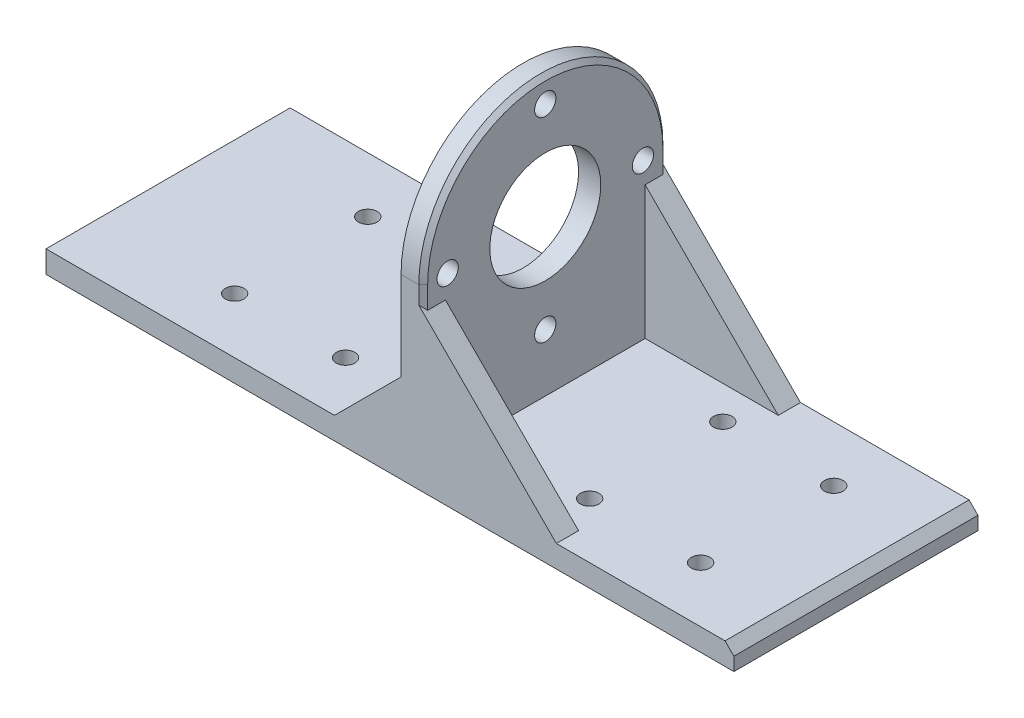
ISO-10303-21;
HEADER;
FILE_DESCRIPTION(('STEP AP214'),'2;1');
FILE_NAME('part.step','',(''),(''),'','','');
FILE_SCHEMA(('AUTOMOTIVE_DESIGN { 1 0 10303 214 1 1 1 1 }'));
ENDSEC;
DATA;
#1=APPLICATION_CONTEXT('core data for automotive mechanical design processes');
#2=APPLICATION_PROTOCOL_DEFINITION('international standard','automotive_design',2000,#1);
#3=PRODUCT_CONTEXT('',#1,'mechanical');
#4=PRODUCT('Part','Part','',(#3));
#5=PRODUCT_RELATED_PRODUCT_CATEGORY('part','',(#4));
#6=PRODUCT_DEFINITION_FORMATION('','',#4);
#7=PRODUCT_DEFINITION_CONTEXT('part definition',#1,'design');
#8=PRODUCT_DEFINITION('design','',#6,#7);
#9=PRODUCT_DEFINITION_SHAPE('','',#8);
#10=(LENGTH_UNIT() NAMED_UNIT(*) SI_UNIT(.MILLI.,.METRE.));
#11=(NAMED_UNIT(*) PLANE_ANGLE_UNIT() SI_UNIT($,.RADIAN.));
#12=(NAMED_UNIT(*) SI_UNIT($,.STERADIAN.) SOLID_ANGLE_UNIT());
#13=UNCERTAINTY_MEASURE_WITH_UNIT(LENGTH_MEASURE(1.E-05),#10,'distance_accuracy_value','');
#14=(GEOMETRIC_REPRESENTATION_CONTEXT(3) GLOBAL_UNCERTAINTY_ASSIGNED_CONTEXT((#13)) GLOBAL_UNIT_ASSIGNED_CONTEXT((#10,
#11,#12)) REPRESENTATION_CONTEXT('',''));
#15=CARTESIAN_POINT('',(0.,0.,0.));
#16=DIRECTION('',(0.,0.,1.));
#17=DIRECTION('',(1.,0.,0.));
#18=AXIS2_PLACEMENT_3D('',#15,#16,#17);
#19=CARTESIAN_POINT('',(5.,0.,0.));
#20=DIRECTION('',(1.,0.,0.));
#21=DIRECTION('',(0.,0.,-1.));
#22=AXIS2_PLACEMENT_3D('',#19,#20,#21);
#23=PLANE('',#22);
#24=DIRECTION('',(0.,0.,-1.));
#25=VECTOR('',#24,1.);
#26=CARTESIAN_POINT('',(5.,-5.00000000000001,0.));
#27=LINE('',#26,#25);
#28=CARTESIAN_POINT('',(5.,-5.00000000000001,-26.5));
#29=VERTEX_POINT('',#28);
#30=CARTESIAN_POINT('',(5.,-5.00000000000001,-22.5));
#31=VERTEX_POINT('',#30);
#32=EDGE_CURVE('E202',#29,#31,#27,.F.);
#33=ORIENTED_EDGE('',*,*,#32,.F.);
#34=DIRECTION('',(0.,1.,0.));
#35=VECTOR('',#34,1.);
#36=CARTESIAN_POINT('',(5.,0.,-26.5));
#37=LINE('',#36,#35);
#38=CARTESIAN_POINT('',(5.,0.,-26.5));
#39=VERTEX_POINT('',#38);
#40=EDGE_CURVE('E408',#29,#39,#37,.T.);
#41=ORIENTED_EDGE('',*,*,#40,.T.);
#42=CARTESIAN_POINT('',(5.,0.,0.));
#43=DIRECTION('',(1.,0.,0.));
#44=DIRECTION('',(0.,0.,-1.));
#45=AXIS2_PLACEMENT_3D('',#42,#43,#44);
#46=CIRCLE('',#45,26.5);
#47=CARTESIAN_POINT('',(5.,0.,26.5));
#48=VERTEX_POINT('',#47);
#49=EDGE_CURVE('E188',#39,#48,#46,.T.);
#50=ORIENTED_EDGE('',*,*,#49,.T.);
#51=DIRECTION('',(0.,-1.,0.));
#52=VECTOR('',#51,1.);
#53=CARTESIAN_POINT('',(5.,-5.00000000000002,26.5));
#54=LINE('',#53,#52);
#55=CARTESIAN_POINT('',(5.,-5.00000000000001,26.5));
#56=VERTEX_POINT('',#55);
#57=EDGE_CURVE('E405',#48,#56,#54,.T.);
#58=ORIENTED_EDGE('',*,*,#57,.T.);
#59=DIRECTION('',(0.,0.,1.));
#60=VECTOR('',#59,1.);
#61=CARTESIAN_POINT('',(5.,-5.00000000000001,0.));
#62=LINE('',#61,#60);
#63=CARTESIAN_POINT('',(5.,-5.00000000000001,22.5));
#64=VERTEX_POINT('',#63);
#65=EDGE_CURVE('E229',#64,#56,#62,.T.);
#66=ORIENTED_EDGE('',*,*,#65,.F.);
#67=DIRECTION('',(0.,-1.,0.));
#68=VECTOR('',#67,1.);
#69=CARTESIAN_POINT('',(5.,0.,22.5));
#70=LINE('',#69,#68);
#71=CARTESIAN_POINT('',(5.,-35.,22.5));
#72=VERTEX_POINT('',#71);
#73=EDGE_CURVE('E222',#64,#72,#70,.T.);
#74=ORIENTED_EDGE('',*,*,#73,.T.);
#75=DIRECTION('',(0.,0.,1.));
#76=VECTOR('',#75,1.);
#77=CARTESIAN_POINT('',(5.,-35.,27.5));
#78=LINE('',#77,#76);
#79=CARTESIAN_POINT('',(5.,-35.,-22.5));
#80=VERTEX_POINT('',#79);
#81=EDGE_CURVE('E233',#80,#72,#78,.T.);
#82=ORIENTED_EDGE('',*,*,#81,.F.);
#83=DIRECTION('',(0.,1.,0.));
#84=VECTOR('',#83,1.);
#85=CARTESIAN_POINT('',(5.,0.,-22.5));
#86=LINE('',#85,#84);
#87=EDGE_CURVE('E196',#80,#31,#86,.T.);
#88=ORIENTED_EDGE('',*,*,#87,.T.);
#89=EDGE_LOOP('',(#33,#41,#50,#58,#66,#74,#82,#88));
#90=FACE_BOUND('',#89,.T.);
#91=CARTESIAN_POINT('',(5.,-22.,0.));
#92=DIRECTION('',(1.,0.,0.));
#93=DIRECTION('',(0.,0.,-1.));
#94=AXIS2_PLACEMENT_3D('',#91,#92,#93);
#95=CIRCLE('',#94,2.4);
#96=CARTESIAN_POINT('',(5.,-22.,-2.4));
#97=VERTEX_POINT('',#96);
#98=EDGE_CURVE('E313',#97,#97,#95,.T.);
#99=ORIENTED_EDGE('',*,*,#98,.F.);
#100=EDGE_LOOP('',(#99));
#101=FACE_BOUND('',#100,.T.);
#102=CARTESIAN_POINT('',(5.,22.,0.));
#103=DIRECTION('',(1.,0.,0.));
#104=DIRECTION('',(0.,0.,-1.));
#105=AXIS2_PLACEMENT_3D('',#102,#103,#104);
#106=CIRCLE('',#105,2.4);
#107=CARTESIAN_POINT('',(5.,22.,-2.4));
#108=VERTEX_POINT('',#107);
#109=EDGE_CURVE('E329',#108,#108,#106,.T.);
#110=ORIENTED_EDGE('',*,*,#109,.F.);
#111=EDGE_LOOP('',(#110));
#112=FACE_BOUND('',#111,.T.);
#113=CARTESIAN_POINT('',(5.,0.,0.));
#114=DIRECTION('',(1.,0.,0.));
#115=DIRECTION('',(0.,0.,-1.));
#116=AXIS2_PLACEMENT_3D('',#113,#114,#115);
#117=CIRCLE('',#116,12.5);
#118=CARTESIAN_POINT('',(5.,0.,-12.5));
#119=VERTEX_POINT('',#118);
#120=EDGE_CURVE('E337',#119,#119,#117,.T.);
#121=ORIENTED_EDGE('',*,*,#120,.F.);
#122=EDGE_LOOP('',(#121));
#123=FACE_BOUND('',#122,.T.);
#124=CARTESIAN_POINT('',(5.,0.,-22.));
#125=DIRECTION('',(1.,0.,0.));
#126=DIRECTION('',(0.,0.,-1.));
#127=AXIS2_PLACEMENT_3D('',#124,#125,#126);
#128=CIRCLE('',#127,2.4);
#129=CARTESIAN_POINT('',(5.,0.,-24.4));
#130=VERTEX_POINT('',#129);
#131=EDGE_CURVE('E321',#130,#130,#128,.T.);
#132=ORIENTED_EDGE('',*,*,#131,.F.);
#133=EDGE_LOOP('',(#132));
#134=FACE_BOUND('',#133,.T.);
#135=CARTESIAN_POINT('',(5.,0.,22.));
#136=DIRECTION('',(1.,0.,0.));
#137=DIRECTION('',(0.,0.,-1.));
#138=AXIS2_PLACEMENT_3D('',#135,#136,#137);
#139=CIRCLE('',#138,2.4);
#140=CARTESIAN_POINT('',(5.,0.,19.6));
#141=VERTEX_POINT('',#140);
#142=EDGE_CURVE('E305',#141,#141,#139,.T.);
#143=ORIENTED_EDGE('',*,*,#142,.F.);
#144=EDGE_LOOP('',(#143));
#145=FACE_BOUND('',#144,.T.);
#146=ADVANCED_FACE('F43',(#90,#101,#112,#123,#134,#145),#23,.T.);
#147=CARTESIAN_POINT('',(0.,0.,0.));
#148=DIRECTION('',(1.,0.,0.));
#149=DIRECTION('',(0.,0.,-1.));
#150=AXIS2_PLACEMENT_3D('',#147,#148,#149);
#151=PLANE('',#150);
#152=CARTESIAN_POINT('',(0.,0.,-22.));
#153=DIRECTION('',(1.,0.,0.));
#154=DIRECTION('',(0.,0.,-1.));
#155=AXIS2_PLACEMENT_3D('',#152,#153,#154);
#156=CIRCLE('',#155,2.4);
#157=CARTESIAN_POINT('',(0.,0.,-24.4));
#158=VERTEX_POINT('',#157);
#159=EDGE_CURVE('E317',#158,#158,#156,.T.);
#160=ORIENTED_EDGE('',*,*,#159,.T.);
#161=EDGE_LOOP('',(#160));
#162=FACE_BOUND('',#161,.T.);
#163=CARTESIAN_POINT('',(0.,0.,0.));
#164=DIRECTION('',(1.,0.,0.));
#165=DIRECTION('',(0.,0.,-1.));
#166=AXIS2_PLACEMENT_3D('',#163,#164,#165);
#167=CIRCLE('',#166,27.5);
#168=CARTESIAN_POINT('',(0.,0.,-27.5));
#169=VERTEX_POINT('',#168);
#170=CARTESIAN_POINT('',(0.,0.,27.5));
#171=VERTEX_POINT('',#170);
#172=EDGE_CURVE('E341',#169,#171,#167,.T.);
#173=ORIENTED_EDGE('',*,*,#172,.F.);
#174=DIRECTION('',(0.,1.,0.));
#175=VECTOR('',#174,1.);
#176=CARTESIAN_POINT('',(0.,-40.,-27.5));
#177=LINE('',#176,#175);
#178=CARTESIAN_POINT('',(0.,-20.,-27.5));
#179=VERTEX_POINT('',#178);
#180=EDGE_CURVE('E352',#179,#169,#177,.T.);
#181=ORIENTED_EDGE('',*,*,#180,.F.);
#182=DIRECTION('',(0.,0.,1.));
#183=VECTOR('',#182,1.);
#184=CARTESIAN_POINT('',(0.,-20.,0.));
#185=LINE('',#184,#183);
#186=CARTESIAN_POINT('',(0.,-20.,-22.5));
#187=VERTEX_POINT('',#186);
#188=EDGE_CURVE('E263',#179,#187,#185,.T.);
#189=ORIENTED_EDGE('',*,*,#188,.T.);
#190=DIRECTION('',(0.,1.,0.));
#191=VECTOR('',#190,1.);
#192=CARTESIAN_POINT('',(0.,0.,-22.5));
#193=LINE('',#192,#191);
#194=CARTESIAN_POINT('',(0.,-30.,-22.5));
#195=VERTEX_POINT('',#194);
#196=EDGE_CURVE('E257',#195,#187,#193,.T.);
#197=ORIENTED_EDGE('',*,*,#196,.F.);
#198=DIRECTION('',(0.,0.,1.));
#199=VECTOR('',#198,1.);
#200=CARTESIAN_POINT('',(0.,-30.,0.));
#201=LINE('',#200,#199);
#202=CARTESIAN_POINT('',(0.,-30.,22.5));
#203=VERTEX_POINT('',#202);
#204=EDGE_CURVE('E383',#195,#203,#201,.T.);
#205=ORIENTED_EDGE('',*,*,#204,.T.);
#206=DIRECTION('',(0.,-1.,0.));
#207=VECTOR('',#206,1.);
#208=CARTESIAN_POINT('',(0.,0.,22.5));
#209=LINE('',#208,#207);
#210=CARTESIAN_POINT('',(0.,-20.,22.5));
#211=VERTEX_POINT('',#210);
#212=EDGE_CURVE('E271',#211,#203,#209,.T.);
#213=ORIENTED_EDGE('',*,*,#212,.F.);
#214=DIRECTION('',(0.,0.,-1.));
#215=VECTOR('',#214,1.);
#216=CARTESIAN_POINT('',(0.,-20.,0.));
#217=LINE('',#216,#215);
#218=CARTESIAN_POINT('',(0.,-20.,27.5));
#219=VERTEX_POINT('',#218);
#220=EDGE_CURVE('E278',#211,#219,#217,.F.);
#221=ORIENTED_EDGE('',*,*,#220,.T.);
#222=DIRECTION('',(0.,-1.,0.));
#223=VECTOR('',#222,1.);
#224=CARTESIAN_POINT('',(0.,0.,27.5));
#225=LINE('',#224,#223);
#226=EDGE_CURVE('E348',#171,#219,#225,.T.);
#227=ORIENTED_EDGE('',*,*,#226,.F.);
#228=EDGE_LOOP('',(#173,#181,#189,#197,#205,#213,#221,#227));
#229=FACE_BOUND('',#228,.T.);
#230=CARTESIAN_POINT('',(0.,0.,0.));
#231=DIRECTION('',(1.,0.,0.));
#232=DIRECTION('',(0.,0.,-1.));
#233=AXIS2_PLACEMENT_3D('',#230,#231,#232);
#234=CIRCLE('',#233,12.5);
#235=CARTESIAN_POINT('',(0.,0.,-12.5));
#236=VERTEX_POINT('',#235);
#237=EDGE_CURVE('E333',#236,#236,#234,.T.);
#238=ORIENTED_EDGE('',*,*,#237,.T.);
#239=EDGE_LOOP('',(#238));
#240=FACE_BOUND('',#239,.T.);
#241=CARTESIAN_POINT('',(0.,22.,0.));
#242=DIRECTION('',(1.,0.,0.));
#243=DIRECTION('',(0.,0.,-1.));
#244=AXIS2_PLACEMENT_3D('',#241,#242,#243);
#245=CIRCLE('',#244,2.4);
#246=CARTESIAN_POINT('',(0.,22.,-2.4));
#247=VERTEX_POINT('',#246);
#248=EDGE_CURVE('E325',#247,#247,#245,.T.);
#249=ORIENTED_EDGE('',*,*,#248,.T.);
#250=EDGE_LOOP('',(#249));
#251=FACE_BOUND('',#250,.T.);
#252=CARTESIAN_POINT('',(0.,-22.,0.));
#253=DIRECTION('',(1.,0.,0.));
#254=DIRECTION('',(0.,0.,-1.));
#255=AXIS2_PLACEMENT_3D('',#252,#253,#254);
#256=CIRCLE('',#255,2.4);
#257=CARTESIAN_POINT('',(0.,-22.,-2.4));
#258=VERTEX_POINT('',#257);
#259=EDGE_CURVE('E309',#258,#258,#256,.T.);
#260=ORIENTED_EDGE('',*,*,#259,.T.);
#261=EDGE_LOOP('',(#260));
#262=FACE_BOUND('',#261,.T.);
#263=CARTESIAN_POINT('',(0.,0.,22.));
#264=DIRECTION('',(1.,0.,0.));
#265=DIRECTION('',(0.,0.,-1.));
#266=AXIS2_PLACEMENT_3D('',#263,#264,#265);
#267=CIRCLE('',#266,2.4);
#268=CARTESIAN_POINT('',(0.,0.,19.6));
#269=VERTEX_POINT('',#268);
#270=EDGE_CURVE('E301',#269,#269,#267,.T.);
#271=ORIENTED_EDGE('',*,*,#270,.T.);
#272=EDGE_LOOP('',(#271));
#273=FACE_BOUND('',#272,.T.);
#274=ADVANCED_FACE('F468',(#162,#229,#240,#251,#262,#273),#151,.F.);
#275=CARTESIAN_POINT('',(5.,0.,0.));
#276=DIRECTION('',(-1.,0.,0.));
#277=DIRECTION('',(0.,0.,1.));
#278=AXIS2_PLACEMENT_3D('',#275,#276,#277);
#279=CYLINDRICAL_SURFACE('',#278,27.5);
#280=DIRECTION('',(-1.,0.,0.));
#281=VECTOR('',#280,1.);
#282=CARTESIAN_POINT('',(5.,0.,27.5));
#283=LINE('',#282,#281);
#284=CARTESIAN_POINT('',(3.99999999999999,0.,27.5));
#285=VERTEX_POINT('',#284);
#286=EDGE_CURVE('E366',#285,#171,#283,.T.);
#287=ORIENTED_EDGE('',*,*,#286,.F.);
#288=CARTESIAN_POINT('',(3.99999999999999,0.,0.));
#289=DIRECTION('',(1.,0.,0.));
#290=DIRECTION('',(0.,0.,-1.));
#291=AXIS2_PLACEMENT_3D('',#288,#289,#290);
#292=CIRCLE('',#291,27.5);
#293=CARTESIAN_POINT('',(3.99999999999999,0.,-27.5));
#294=VERTEX_POINT('',#293);
#295=EDGE_CURVE('E419',#285,#294,#292,.F.);
#296=ORIENTED_EDGE('',*,*,#295,.T.);
#297=DIRECTION('',(-1.,0.,0.));
#298=VECTOR('',#297,1.);
#299=CARTESIAN_POINT('',(5.,0.,-27.5));
#300=LINE('',#299,#298);
#301=EDGE_CURVE('E356',#294,#169,#300,.T.);
#302=ORIENTED_EDGE('',*,*,#301,.T.);
#303=ORIENTED_EDGE('',*,*,#172,.T.);
#304=EDGE_LOOP('',(#287,#296,#302,#303));
#305=FACE_BOUND('',#304,.T.);
#306=ADVANCED_FACE('F474',(#305),#279,.T.);
#307=CARTESIAN_POINT('',(5.,0.,27.5));
#308=DIRECTION('',(0.,0.,-1.));
#309=DIRECTION('',(0.,1.,0.));
#310=AXIS2_PLACEMENT_3D('',#307,#308,#309);
#311=PLANE('',#310);
#312=DIRECTION('',(0.,-1.,0.));
#313=VECTOR('',#312,1.);
#314=CARTESIAN_POINT('',(75.,-40.,27.5));
#315=LINE('',#314,#313);
#316=CARTESIAN_POINT('',(75.,-37.,27.5));
#317=VERTEX_POINT('',#316);
#318=CARTESIAN_POINT('',(75.,-40.,27.5));
#319=VERTEX_POINT('',#318);
#320=EDGE_CURVE('E234',#317,#319,#315,.T.);
#321=ORIENTED_EDGE('',*,*,#320,.F.);
#322=DIRECTION('',(0.707106781186548,-0.707106781186548,0.));
#323=VECTOR('',#322,1.);
#324=CARTESIAN_POINT('',(75.,-37.,27.5));
#325=LINE('',#324,#323);
#326=CARTESIAN_POINT('',(73.,-35.,27.5));
#327=VERTEX_POINT('',#326);
#328=EDGE_CURVE('E67',#317,#327,#325,.F.);
#329=ORIENTED_EDGE('',*,*,#328,.T.);
#330=DIRECTION('',(-1.,0.,0.));
#331=VECTOR('',#330,1.);
#332=CARTESIAN_POINT('',(75.,-35.,27.5));
#333=LINE('',#332,#331);
#334=CARTESIAN_POINT('',(35.,-35.,27.5));
#335=VERTEX_POINT('',#334);
#336=EDGE_CURVE('E245',#327,#335,#333,.T.);
#337=ORIENTED_EDGE('',*,*,#336,.T.);
#338=DIRECTION('',(-0.707106781186548,0.707106781186547,0.));
#339=VECTOR('',#338,1.);
#340=CARTESIAN_POINT('',(35.,-35.,27.5));
#341=LINE('',#340,#339);
#342=CARTESIAN_POINT('',(3.99999999999999,-4.,27.5));
#343=VERTEX_POINT('',#342);
#344=EDGE_CURVE('E219',#335,#343,#341,.T.);
#345=ORIENTED_EDGE('',*,*,#344,.T.);
#346=DIRECTION('',(0.,1.,0.));
#347=VECTOR('',#346,1.);
#348=CARTESIAN_POINT('',(3.99999999999999,0.,27.5));
#349=LINE('',#348,#347);
#350=EDGE_CURVE('E416',#343,#285,#349,.T.);
#351=ORIENTED_EDGE('',*,*,#350,.T.);
#352=ORIENTED_EDGE('',*,*,#286,.T.);
#353=ORIENTED_EDGE('',*,*,#226,.T.);
#354=DIRECTION('',(0.707106781186548,0.707106781186547,0.));
#355=VECTOR('',#354,1.);
#356=CARTESIAN_POINT('',(-15.,-35.,27.5));
#357=LINE('',#356,#355);
#358=CARTESIAN_POINT('',(-15.,-35.,27.5));
#359=VERTEX_POINT('',#358);
#360=EDGE_CURVE('E268',#359,#219,#357,.T.);
#361=ORIENTED_EDGE('',*,*,#360,.F.);
#362=DIRECTION('',(1.,0.,0.));
#363=VECTOR('',#362,1.);
#364=CARTESIAN_POINT('',(-80.,-35.,27.5));
#365=LINE('',#364,#363);
#366=CARTESIAN_POINT('',(-80.,-35.,27.5));
#367=VERTEX_POINT('',#366);
#368=EDGE_CURVE('E297',#367,#359,#365,.T.);
#369=ORIENTED_EDGE('',*,*,#368,.F.);
#370=DIRECTION('',(0.,1.,0.));
#371=VECTOR('',#370,1.);
#372=CARTESIAN_POINT('',(-80.,-40.,27.5));
#373=LINE('',#372,#371);
#374=CARTESIAN_POINT('',(-80.,-40.,27.5));
#375=VERTEX_POINT('',#374);
#376=EDGE_CURVE('E289',#375,#367,#373,.T.);
#377=ORIENTED_EDGE('',*,*,#376,.F.);
#378=DIRECTION('',(-1.,0.,0.));
#379=VECTOR('',#378,1.);
#380=CARTESIAN_POINT('',(5.,-40.,27.5));
#381=LINE('',#380,#379);
#382=EDGE_CURVE('E362',#319,#375,#381,.T.);
#383=ORIENTED_EDGE('',*,*,#382,.F.);
#384=EDGE_LOOP('',(#321,#329,#337,#345,#351,#352,#353,#361,#369,#377,#383));
#385=FACE_BOUND('',#384,.T.);
#386=ADVANCED_FACE('F450',(#385),#311,.F.);
#387=CARTESIAN_POINT('',(5.,-40.,27.5));
#388=DIRECTION('',(0.,1.,0.));
#389=DIRECTION('',(0.,0.,1.));
#390=AXIS2_PLACEMENT_3D('',#387,#388,#389);
#391=PLANE('',#390);
#392=CARTESIAN_POINT('',(55.,-40.,15.));
#393=DIRECTION('',(0.,1.,0.));
#394=DIRECTION('',(0.,0.,1.));
#395=AXIS2_PLACEMENT_3D('',#392,#393,#394);
#396=CIRCLE('',#395,2.1);
#397=CARTESIAN_POINT('',(55.,-40.,17.1));
#398=VERTEX_POINT('',#397);
#399=EDGE_CURVE('E918',#398,#398,#396,.F.);
#400=ORIENTED_EDGE('',*,*,#399,.F.);
#401=EDGE_LOOP('',(#400));
#402=FACE_BOUND('',#401,.T.);
#403=CARTESIAN_POINT('',(-25.,-40.,-15.));
#404=DIRECTION('',(0.,1.,0.));
#405=DIRECTION('',(0.,0.,1.));
#406=AXIS2_PLACEMENT_3D('',#403,#404,#405);
#407=CIRCLE('',#406,2.1);
#408=CARTESIAN_POINT('',(-25.,-40.,-12.9));
#409=VERTEX_POINT('',#408);
#410=EDGE_CURVE('E914',#409,#409,#407,.F.);
#411=ORIENTED_EDGE('',*,*,#410,.F.);
#412=EDGE_LOOP('',(#411));
#413=FACE_BOUND('',#412,.T.);
#414=CARTESIAN_POINT('',(-50.,-40.,-15.));
#415=DIRECTION('',(0.,1.,0.));
#416=DIRECTION('',(0.,0.,1.));
#417=AXIS2_PLACEMENT_3D('',#414,#415,#416);
#418=CIRCLE('',#417,2.1);
#419=CARTESIAN_POINT('',(-50.,-40.,-12.9));
#420=VERTEX_POINT('',#419);
#421=EDGE_CURVE('E907',#420,#420,#418,.F.);
#422=ORIENTED_EDGE('',*,*,#421,.F.);
#423=EDGE_LOOP('',(#422));
#424=FACE_BOUND('',#423,.T.);
#425=CARTESIAN_POINT('',(55.,-40.,-15.));
#426=DIRECTION('',(0.,1.,0.));
#427=DIRECTION('',(0.,0.,1.));
#428=AXIS2_PLACEMENT_3D('',#425,#426,#427);
#429=CIRCLE('',#428,2.1);
#430=CARTESIAN_POINT('',(55.,-40.,-12.9));
#431=VERTEX_POINT('',#430);
#432=EDGE_CURVE('E901',#431,#431,#429,.F.);
#433=ORIENTED_EDGE('',*,*,#432,.F.);
#434=EDGE_LOOP('',(#433));
#435=FACE_BOUND('',#434,.T.);
#436=CARTESIAN_POINT('',(30.,-40.,15.));
#437=DIRECTION('',(0.,1.,0.));
#438=DIRECTION('',(0.,0.,1.));
#439=AXIS2_PLACEMENT_3D('',#436,#437,#438);
#440=CIRCLE('',#439,2.1);
#441=CARTESIAN_POINT('',(30.,-40.,17.1));
#442=VERTEX_POINT('',#441);
#443=EDGE_CURVE('E925',#442,#442,#440,.F.);
#444=ORIENTED_EDGE('',*,*,#443,.F.);
#445=EDGE_LOOP('',(#444));
#446=FACE_BOUND('',#445,.T.);
#447=CARTESIAN_POINT('',(-25.,-40.,15.));
#448=DIRECTION('',(0.,1.,0.));
#449=DIRECTION('',(0.,0.,1.));
#450=AXIS2_PLACEMENT_3D('',#447,#448,#449);
#451=CIRCLE('',#450,2.1);
#452=CARTESIAN_POINT('',(-25.,-40.,17.1));
#453=VERTEX_POINT('',#452);
#454=EDGE_CURVE('E940',#453,#453,#451,.F.);
#455=ORIENTED_EDGE('',*,*,#454,.F.);
#456=EDGE_LOOP('',(#455));
#457=FACE_BOUND('',#456,.T.);
#458=CARTESIAN_POINT('',(-50.,-40.,15.));
#459=DIRECTION('',(0.,1.,0.));
#460=DIRECTION('',(0.,0.,1.));
#461=AXIS2_PLACEMENT_3D('',#458,#459,#460);
#462=CIRCLE('',#461,2.1);
#463=CARTESIAN_POINT('',(-50.,-40.,17.1));
#464=VERTEX_POINT('',#463);
#465=EDGE_CURVE('E932',#464,#464,#462,.F.);
#466=ORIENTED_EDGE('',*,*,#465,.F.);
#467=EDGE_LOOP('',(#466));
#468=FACE_BOUND('',#467,.T.);
#469=CARTESIAN_POINT('',(30.,-40.,-15.));
#470=DIRECTION('',(0.,1.,0.));
#471=DIRECTION('',(0.,0.,1.));
#472=AXIS2_PLACEMENT_3D('',#469,#470,#471);
#473=CIRCLE('',#472,2.1);
#474=CARTESIAN_POINT('',(30.,-40.,-12.9));
#475=VERTEX_POINT('',#474);
#476=EDGE_CURVE('E205',#475,#475,#473,.F.);
#477=ORIENTED_EDGE('',*,*,#476,.F.);
#478=EDGE_LOOP('',(#477));
#479=FACE_BOUND('',#478,.T.);
#480=DIRECTION('',(0.,0.,1.));
#481=VECTOR('',#480,1.);
#482=CARTESIAN_POINT('',(-80.,-40.,-27.5));
#483=LINE('',#482,#481);
#484=CARTESIAN_POINT('',(-80.,-40.,-27.5));
#485=VERTEX_POINT('',#484);
#486=EDGE_CURVE('E293',#485,#375,#483,.T.);
#487=ORIENTED_EDGE('',*,*,#486,.F.);
#488=DIRECTION('',(-1.,0.,0.));
#489=VECTOR('',#488,1.);
#490=CARTESIAN_POINT('',(5.,-40.,-27.5));
#491=LINE('',#490,#489);
#492=CARTESIAN_POINT('',(75.,-40.,-27.5));
#493=VERTEX_POINT('',#492);
#494=EDGE_CURVE('E359',#493,#485,#491,.T.);
#495=ORIENTED_EDGE('',*,*,#494,.F.);
#496=DIRECTION('',(0.,0.,-1.));
#497=VECTOR('',#496,1.);
#498=CARTESIAN_POINT('',(75.,-40.,27.5));
#499=LINE('',#498,#497);
#500=EDGE_CURVE('E237',#319,#493,#499,.T.);
#501=ORIENTED_EDGE('',*,*,#500,.F.);
#502=ORIENTED_EDGE('',*,*,#382,.T.);
#503=EDGE_LOOP('',(#487,#495,#501,#502));
#504=FACE_BOUND('',#503,.T.);
#505=ADVANCED_FACE('F456',(#402,#413,#424,#435,#446,#457,#468,#479,#504),#391,.F.);
#506=CARTESIAN_POINT('',(5.,-40.,-27.5));
#507=DIRECTION('',(0.,0.,1.));
#508=DIRECTION('',(0.,-1.,0.));
#509=AXIS2_PLACEMENT_3D('',#506,#507,#508);
#510=PLANE('',#509);
#511=DIRECTION('',(-1.,0.,0.));
#512=VECTOR('',#511,1.);
#513=CARTESIAN_POINT('',(75.,-35.,-27.5));
#514=LINE('',#513,#512);
#515=CARTESIAN_POINT('',(73.,-35.,-27.5));
#516=VERTEX_POINT('',#515);
#517=CARTESIAN_POINT('',(35.,-35.,-27.5));
#518=VERTEX_POINT('',#517);
#519=EDGE_CURVE('E183',#516,#518,#514,.T.);
#520=ORIENTED_EDGE('',*,*,#519,.F.);
#521=DIRECTION('',(-0.707106781186548,0.707106781186548,0.));
#522=VECTOR('',#521,1.);
#523=CARTESIAN_POINT('',(75.,-37.,-27.5));
#524=LINE('',#523,#522);
#525=CARTESIAN_POINT('',(75.,-37.,-27.5));
#526=VERTEX_POINT('',#525);
#527=EDGE_CURVE('E11',#516,#526,#524,.F.);
#528=ORIENTED_EDGE('',*,*,#527,.T.);
#529=DIRECTION('',(0.,1.,0.));
#530=VECTOR('',#529,1.);
#531=CARTESIAN_POINT('',(75.,-40.,-27.5));
#532=LINE('',#531,#530);
#533=EDGE_CURVE('E241',#493,#526,#532,.T.);
#534=ORIENTED_EDGE('',*,*,#533,.F.);
#535=ORIENTED_EDGE('',*,*,#494,.T.);
#536=DIRECTION('',(0.,1.,0.));
#537=VECTOR('',#536,1.);
#538=CARTESIAN_POINT('',(-80.,-40.,-27.5));
#539=LINE('',#538,#537);
#540=CARTESIAN_POINT('',(-80.,-35.,-27.5));
#541=VERTEX_POINT('',#540);
#542=EDGE_CURVE('E282',#485,#541,#539,.T.);
#543=ORIENTED_EDGE('',*,*,#542,.T.);
#544=DIRECTION('',(1.,0.,0.));
#545=VECTOR('',#544,1.);
#546=CARTESIAN_POINT('',(-80.,-35.,-27.5));
#547=LINE('',#546,#545);
#548=CARTESIAN_POINT('',(-15.,-35.,-27.5));
#549=VERTEX_POINT('',#548);
#550=EDGE_CURVE('E296',#541,#549,#547,.T.);
#551=ORIENTED_EDGE('',*,*,#550,.T.);
#552=DIRECTION('',(0.707106781186548,0.707106781186547,0.));
#553=VECTOR('',#552,1.);
#554=CARTESIAN_POINT('',(-15.,-35.,-27.5));
#555=LINE('',#554,#553);
#556=EDGE_CURVE('E253',#549,#179,#555,.T.);
#557=ORIENTED_EDGE('',*,*,#556,.T.);
#558=ORIENTED_EDGE('',*,*,#180,.T.);
#559=ORIENTED_EDGE('',*,*,#301,.F.);
#560=DIRECTION('',(0.,-1.,0.));
#561=VECTOR('',#560,1.);
#562=CARTESIAN_POINT('',(3.99999999999999,-5.00000000000002,-27.5));
#563=LINE('',#562,#561);
#564=CARTESIAN_POINT('',(4.,-4.00000000000001,-27.5));
#565=VERTEX_POINT('',#564);
#566=EDGE_CURVE('E412',#294,#565,#563,.T.);
#567=ORIENTED_EDGE('',*,*,#566,.T.);
#568=DIRECTION('',(-0.707106781186548,0.707106781186547,0.));
#569=VECTOR('',#568,1.);
#570=CARTESIAN_POINT('',(35.,-35.,-27.5));
#571=LINE('',#570,#569);
#572=EDGE_CURVE('E204',#518,#565,#571,.T.);
#573=ORIENTED_EDGE('',*,*,#572,.F.);
#574=EDGE_LOOP('',(#520,#528,#534,#535,#543,#551,#557,#558,#559,#567,#573));
#575=FACE_BOUND('',#574,.T.);
#576=ADVANCED_FACE('F458',(#575),#510,.F.);
#577=CARTESIAN_POINT('',(5.,0.,0.));
#578=DIRECTION('',(-1.,0.,0.));
#579=DIRECTION('',(0.,0.,1.));
#580=AXIS2_PLACEMENT_3D('',#577,#578,#579);
#581=CYLINDRICAL_SURFACE('',#580,12.5);
#582=ORIENTED_EDGE('',*,*,#120,.T.);
#583=EDGE_LOOP('',(#582));
#584=FACE_BOUND('',#583,.T.);
#585=ORIENTED_EDGE('',*,*,#237,.F.);
#586=EDGE_LOOP('',(#585));
#587=FACE_BOUND('',#586,.T.);
#588=ADVANCED_FACE('F479',(#584,#587),#581,.F.);
#589=CARTESIAN_POINT('',(5.,22.,0.));
#590=DIRECTION('',(-1.,0.,0.));
#591=DIRECTION('',(0.,0.,1.));
#592=AXIS2_PLACEMENT_3D('',#589,#590,#591);
#593=CYLINDRICAL_SURFACE('',#592,2.4);
#594=ORIENTED_EDGE('',*,*,#109,.T.);
#595=EDGE_LOOP('',(#594));
#596=FACE_BOUND('',#595,.T.);
#597=ORIENTED_EDGE('',*,*,#248,.F.);
#598=EDGE_LOOP('',(#597));
#599=FACE_BOUND('',#598,.T.);
#600=ADVANCED_FACE('F580',(#596,#599),#593,.F.);
#601=CARTESIAN_POINT('',(5.,0.,-22.));
#602=DIRECTION('',(-1.,0.,0.));
#603=DIRECTION('',(0.,0.,1.));
#604=AXIS2_PLACEMENT_3D('',#601,#602,#603);
#605=CYLINDRICAL_SURFACE('',#604,2.4);
#606=ORIENTED_EDGE('',*,*,#159,.F.);
#607=EDGE_LOOP('',(#606));
#608=FACE_BOUND('',#607,.T.);
#609=ORIENTED_EDGE('',*,*,#131,.T.);
#610=EDGE_LOOP('',(#609));
#611=FACE_BOUND('',#610,.T.);
#612=ADVANCED_FACE('F577',(#608,#611),#605,.F.);
#613=CARTESIAN_POINT('',(5.,-22.,0.));
#614=DIRECTION('',(-1.,0.,0.));
#615=DIRECTION('',(0.,0.,1.));
#616=AXIS2_PLACEMENT_3D('',#613,#614,#615);
#617=CYLINDRICAL_SURFACE('',#616,2.4);
#618=ORIENTED_EDGE('',*,*,#98,.T.);
#619=EDGE_LOOP('',(#618));
#620=FACE_BOUND('',#619,.T.);
#621=ORIENTED_EDGE('',*,*,#259,.F.);
#622=EDGE_LOOP('',(#621));
#623=FACE_BOUND('',#622,.T.);
#624=ADVANCED_FACE('F573',(#620,#623),#617,.F.);
#625=CARTESIAN_POINT('',(5.,0.,22.));
#626=DIRECTION('',(-1.,0.,0.));
#627=DIRECTION('',(0.,0.,1.));
#628=AXIS2_PLACEMENT_3D('',#625,#626,#627);
#629=CYLINDRICAL_SURFACE('',#628,2.4);
#630=ORIENTED_EDGE('',*,*,#270,.F.);
#631=EDGE_LOOP('',(#630));
#632=FACE_BOUND('',#631,.T.);
#633=ORIENTED_EDGE('',*,*,#142,.T.);
#634=EDGE_LOOP('',(#633));
#635=FACE_BOUND('',#634,.T.);
#636=ADVANCED_FACE('F566',(#632,#635),#629,.F.);
#637=CARTESIAN_POINT('',(-80.,-35.,-27.5));
#638=DIRECTION('',(0.,1.,0.));
#639=DIRECTION('',(0.,0.,1.));
#640=AXIS2_PLACEMENT_3D('',#637,#638,#639);
#641=PLANE('',#640);
#642=CARTESIAN_POINT('',(-25.,-35.,-15.));
#643=DIRECTION('',(0.,1.,0.));
#644=DIRECTION('',(0.,0.,1.));
#645=AXIS2_PLACEMENT_3D('',#642,#643,#644);
#646=CIRCLE('',#645,2.1);
#647=CARTESIAN_POINT('',(-25.,-35.,-12.9));
#648=VERTEX_POINT('',#647);
#649=EDGE_CURVE('E922',#648,#648,#646,.T.);
#650=ORIENTED_EDGE('',*,*,#649,.F.);
#651=EDGE_LOOP('',(#650));
#652=FACE_BOUND('',#651,.T.);
#653=CARTESIAN_POINT('',(-50.,-35.,-15.));
#654=DIRECTION('',(0.,1.,0.));
#655=DIRECTION('',(0.,0.,1.));
#656=AXIS2_PLACEMENT_3D('',#653,#654,#655);
#657=CIRCLE('',#656,2.1);
#658=CARTESIAN_POINT('',(-50.,-35.,-12.9));
#659=VERTEX_POINT('',#658);
#660=EDGE_CURVE('E911',#659,#659,#657,.T.);
#661=ORIENTED_EDGE('',*,*,#660,.F.);
#662=EDGE_LOOP('',(#661));
#663=FACE_BOUND('',#662,.T.);
#664=CARTESIAN_POINT('',(-25.,-35.,15.));
#665=DIRECTION('',(0.,1.,0.));
#666=DIRECTION('',(0.,0.,-1.));
#667=AXIS2_PLACEMENT_3D('',#664,#665,#666);
#668=CIRCLE('',#667,2.1);
#669=CARTESIAN_POINT('',(-25.,-35.,12.9));
#670=VERTEX_POINT('',#669);
#671=EDGE_CURVE('E936',#670,#670,#668,.T.);
#672=ORIENTED_EDGE('',*,*,#671,.F.);
#673=EDGE_LOOP('',(#672));
#674=FACE_BOUND('',#673,.T.);
#675=CARTESIAN_POINT('',(-50.,-35.,15.));
#676=DIRECTION('',(0.,1.,0.));
#677=DIRECTION('',(0.,0.,-1.));
#678=AXIS2_PLACEMENT_3D('',#675,#676,#677);
#679=CIRCLE('',#678,2.1);
#680=CARTESIAN_POINT('',(-50.,-35.,12.9));
#681=VERTEX_POINT('',#680);
#682=EDGE_CURVE('E437',#681,#681,#679,.T.);
#683=ORIENTED_EDGE('',*,*,#682,.F.);
#684=EDGE_LOOP('',(#683));
#685=FACE_BOUND('',#684,.T.);
#686=DIRECTION('',(0.,0.,1.));
#687=VECTOR('',#686,1.);
#688=CARTESIAN_POINT('',(-80.,-35.,-27.5));
#689=LINE('',#688,#687);
#690=EDGE_CURVE('E286',#541,#367,#689,.T.);
#691=ORIENTED_EDGE('',*,*,#690,.T.);
#692=ORIENTED_EDGE('',*,*,#368,.T.);
#693=DIRECTION('',(0.,0.,-1.));
#694=VECTOR('',#693,1.);
#695=CARTESIAN_POINT('',(-15.,-35.,-27.5));
#696=LINE('',#695,#694);
#697=CARTESIAN_POINT('',(-15.,-35.,22.5));
#698=VERTEX_POINT('',#697);
#699=EDGE_CURVE('E373',#698,#359,#696,.F.);
#700=ORIENTED_EDGE('',*,*,#699,.F.);
#701=DIRECTION('',(1.,0.,0.));
#702=VECTOR('',#701,1.);
#703=CARTESIAN_POINT('',(-80.,-35.,22.5));
#704=LINE('',#703,#702);
#705=CARTESIAN_POINT('',(-4.99999999999998,-35.,22.5));
#706=VERTEX_POINT('',#705);
#707=EDGE_CURVE('E369',#698,#706,#704,.T.);
#708=ORIENTED_EDGE('',*,*,#707,.T.);
#709=DIRECTION('',(0.,0.,-1.));
#710=VECTOR('',#709,1.);
#711=CARTESIAN_POINT('',(-4.99999999999998,-35.,-27.5));
#712=LINE('',#711,#710);
#713=CARTESIAN_POINT('',(-4.99999999999998,-35.,-22.5));
#714=VERTEX_POINT('',#713);
#715=EDGE_CURVE('E390',#706,#714,#712,.T.);
#716=ORIENTED_EDGE('',*,*,#715,.T.);
#717=DIRECTION('',(-1.,0.,0.));
#718=VECTOR('',#717,1.);
#719=CARTESIAN_POINT('',(-80.,-35.,-22.5));
#720=LINE('',#719,#718);
#721=CARTESIAN_POINT('',(-15.,-35.,-22.5));
#722=VERTEX_POINT('',#721);
#723=EDGE_CURVE('E376',#714,#722,#720,.T.);
#724=ORIENTED_EDGE('',*,*,#723,.T.);
#725=DIRECTION('',(0.,0.,1.));
#726=VECTOR('',#725,1.);
#727=CARTESIAN_POINT('',(-15.,-35.,-27.5));
#728=LINE('',#727,#726);
#729=EDGE_CURVE('E379',#549,#722,#728,.T.);
#730=ORIENTED_EDGE('',*,*,#729,.F.);
#731=ORIENTED_EDGE('',*,*,#550,.F.);
#732=EDGE_LOOP('',(#691,#692,#700,#708,#716,#724,#730,#731));
#733=FACE_BOUND('',#732,.T.);
#734=ADVANCED_FACE('F551',(#652,#663,#674,#685,#733),#641,.T.);
#735=CARTESIAN_POINT('',(-80.,0.,0.));
#736=DIRECTION('',(1.,0.,0.));
#737=DIRECTION('',(0.,0.,-1.));
#738=AXIS2_PLACEMENT_3D('',#735,#736,#737);
#739=PLANE('',#738);
#740=ORIENTED_EDGE('',*,*,#486,.T.);
#741=ORIENTED_EDGE('',*,*,#376,.T.);
#742=ORIENTED_EDGE('',*,*,#690,.F.);
#743=ORIENTED_EDGE('',*,*,#542,.F.);
#744=EDGE_LOOP('',(#740,#741,#742,#743));
#745=FACE_BOUND('',#744,.T.);
#746=ADVANCED_FACE('F556',(#745),#739,.F.);
#747=CARTESIAN_POINT('',(-15.,-35.,25.));
#748=DIRECTION('',(0.707106781186547,-0.707106781186548,0.));
#749=DIRECTION('',(0.707106781186548,0.707106781186547,0.));
#750=AXIS2_PLACEMENT_3D('',#747,#748,#749);
#751=PLANE('',#750);
#752=ORIENTED_EDGE('',*,*,#220,.F.);
#753=DIRECTION('',(0.707106781186548,0.707106781186547,0.));
#754=VECTOR('',#753,1.);
#755=CARTESIAN_POINT('',(-15.,-35.,22.5));
#756=LINE('',#755,#754);
#757=EDGE_CURVE('E267',#698,#211,#756,.T.);
#758=ORIENTED_EDGE('',*,*,#757,.F.);
#759=ORIENTED_EDGE('',*,*,#699,.T.);
#760=ORIENTED_EDGE('',*,*,#360,.T.);
#761=EDGE_LOOP('',(#752,#758,#759,#760));
#762=FACE_BOUND('',#761,.T.);
#763=ADVANCED_FACE('F558',(#762),#751,.F.);
#764=CARTESIAN_POINT('',(-37.5,-6.25,22.5));
#765=DIRECTION('',(0.,0.,1.));
#766=DIRECTION('',(1.,0.,0.));
#767=AXIS2_PLACEMENT_3D('',#764,#765,#766);
#768=PLANE('',#767);
#769=ORIENTED_EDGE('',*,*,#212,.T.);
#770=DIRECTION('',(-0.707106781186544,-0.707106781186551,0.));
#771=VECTOR('',#770,1.);
#772=CARTESIAN_POINT('',(0.,-30.,22.5));
#773=LINE('',#772,#771);
#774=EDGE_CURVE('E387',#203,#706,#773,.T.);
#775=ORIENTED_EDGE('',*,*,#774,.T.);
#776=ORIENTED_EDGE('',*,*,#707,.F.);
#777=ORIENTED_EDGE('',*,*,#757,.T.);
#778=EDGE_LOOP('',(#769,#775,#776,#777));
#779=FACE_BOUND('',#778,.T.);
#780=ADVANCED_FACE('F564',(#779),#768,.F.);
#781=CARTESIAN_POINT('',(-15.,-35.,-25.));
#782=DIRECTION('',(-0.707106781186547,0.707106781186548,0.));
#783=DIRECTION('',(0.707106781186548,0.707106781186547,0.));
#784=AXIS2_PLACEMENT_3D('',#781,#782,#783);
#785=PLANE('',#784);
#786=ORIENTED_EDGE('',*,*,#188,.F.);
#787=ORIENTED_EDGE('',*,*,#556,.F.);
#788=ORIENTED_EDGE('',*,*,#729,.T.);
#789=DIRECTION('',(0.707106781186548,0.707106781186547,0.));
#790=VECTOR('',#789,1.);
#791=CARTESIAN_POINT('',(-15.,-35.,-22.5));
#792=LINE('',#791,#790);
#793=EDGE_CURVE('E252',#722,#187,#792,.T.);
#794=ORIENTED_EDGE('',*,*,#793,.T.);
#795=EDGE_LOOP('',(#786,#787,#788,#794));
#796=FACE_BOUND('',#795,.T.);
#797=ADVANCED_FACE('F779',(#796),#785,.T.);
#798=CARTESIAN_POINT('',(-37.5,-6.25,-22.5));
#799=DIRECTION('',(0.,0.,-1.));
#800=DIRECTION('',(-1.,0.,0.));
#801=AXIS2_PLACEMENT_3D('',#798,#799,#800);
#802=PLANE('',#801);
#803=ORIENTED_EDGE('',*,*,#723,.F.);
#804=DIRECTION('',(0.707106781186544,0.707106781186551,0.));
#805=VECTOR('',#804,1.);
#806=CARTESIAN_POINT('',(0.,-30.,-22.5));
#807=LINE('',#806,#805);
#808=EDGE_CURVE('E393',#714,#195,#807,.T.);
#809=ORIENTED_EDGE('',*,*,#808,.T.);
#810=ORIENTED_EDGE('',*,*,#196,.T.);
#811=ORIENTED_EDGE('',*,*,#793,.F.);
#812=EDGE_LOOP('',(#803,#809,#810,#811));
#813=FACE_BOUND('',#812,.T.);
#814=ADVANCED_FACE('F498',(#813),#802,.F.);
#815=CARTESIAN_POINT('',(0.,-30.,0.));
#816=DIRECTION('',(0.707106781186551,-0.707106781186544,0.));
#817=DIRECTION('',(0.,0.,1.));
#818=AXIS2_PLACEMENT_3D('',#815,#816,#817);
#819=PLANE('',#818);
#820=ORIENTED_EDGE('',*,*,#808,.F.);
#821=ORIENTED_EDGE('',*,*,#715,.F.);
#822=ORIENTED_EDGE('',*,*,#774,.F.);
#823=ORIENTED_EDGE('',*,*,#204,.F.);
#824=EDGE_LOOP('',(#820,#821,#822,#823));
#825=FACE_BOUND('',#824,.T.);
#826=ADVANCED_FACE('F493',(#825),#819,.F.);
#827=CARTESIAN_POINT('',(75.,-35.,27.5));
#828=DIRECTION('',(0.,-1.,0.));
#829=DIRECTION('',(0.,0.,-1.));
#830=AXIS2_PLACEMENT_3D('',#827,#828,#829);
#831=PLANE('',#830);
#832=CARTESIAN_POINT('',(55.,-35.,15.));
#833=DIRECTION('',(0.,1.,0.));
#834=DIRECTION('',(0.,0.,-1.));
#835=AXIS2_PLACEMENT_3D('',#832,#833,#834);
#836=CIRCLE('',#835,2.1);
#837=CARTESIAN_POINT('',(55.,-35.,12.9));
#838=VERTEX_POINT('',#837);
#839=EDGE_CURVE('E889',#838,#838,#836,.T.);
#840=ORIENTED_EDGE('',*,*,#839,.F.);
#841=EDGE_LOOP('',(#840));
#842=FACE_BOUND('',#841,.T.);
#843=CARTESIAN_POINT('',(55.,-35.,-15.));
#844=DIRECTION('',(0.,1.,0.));
#845=DIRECTION('',(0.,0.,1.));
#846=AXIS2_PLACEMENT_3D('',#843,#844,#845);
#847=CIRCLE('',#846,2.1);
#848=CARTESIAN_POINT('',(55.,-35.,-12.9));
#849=VERTEX_POINT('',#848);
#850=EDGE_CURVE('E893',#849,#849,#847,.T.);
#851=ORIENTED_EDGE('',*,*,#850,.F.);
#852=EDGE_LOOP('',(#851));
#853=FACE_BOUND('',#852,.T.);
#854=CARTESIAN_POINT('',(30.,-35.,15.));
#855=DIRECTION('',(0.,1.,0.));
#856=DIRECTION('',(0.,0.,-1.));
#857=AXIS2_PLACEMENT_3D('',#854,#855,#856);
#858=CIRCLE('',#857,2.1);
#859=CARTESIAN_POINT('',(30.,-35.,12.9));
#860=VERTEX_POINT('',#859);
#861=EDGE_CURVE('E897',#860,#860,#858,.T.);
#862=ORIENTED_EDGE('',*,*,#861,.F.);
#863=EDGE_LOOP('',(#862));
#864=FACE_BOUND('',#863,.T.);
#865=CARTESIAN_POINT('',(30.,-35.,-15.));
#866=DIRECTION('',(0.,1.,0.));
#867=DIRECTION('',(0.,0.,1.));
#868=AXIS2_PLACEMENT_3D('',#865,#866,#867);
#869=CIRCLE('',#868,2.1);
#870=CARTESIAN_POINT('',(30.,-35.,-12.9));
#871=VERTEX_POINT('',#870);
#872=EDGE_CURVE('E211',#871,#871,#869,.T.);
#873=ORIENTED_EDGE('',*,*,#872,.F.);
#874=EDGE_LOOP('',(#873));
#875=FACE_BOUND('',#874,.T.);
#876=ORIENTED_EDGE('',*,*,#336,.F.);
#877=DIRECTION('',(0.,0.,-1.));
#878=VECTOR('',#877,1.);
#879=CARTESIAN_POINT('',(73.,-35.,27.5));
#880=LINE('',#879,#878);
#881=EDGE_CURVE('E53',#327,#516,#880,.T.);
#882=ORIENTED_EDGE('',*,*,#881,.T.);
#883=ORIENTED_EDGE('',*,*,#519,.T.);
#884=DIRECTION('',(0.,0.,-1.));
#885=VECTOR('',#884,1.);
#886=CARTESIAN_POINT('',(35.,-35.,27.5));
#887=LINE('',#886,#885);
#888=CARTESIAN_POINT('',(35.,-35.,-22.5));
#889=VERTEX_POINT('',#888);
#890=EDGE_CURVE('E178',#518,#889,#887,.F.);
#891=ORIENTED_EDGE('',*,*,#890,.T.);
#892=DIRECTION('',(1.,0.,0.));
#893=VECTOR('',#892,1.);
#894=CARTESIAN_POINT('',(75.,-35.,-22.5));
#895=LINE('',#894,#893);
#896=EDGE_CURVE('E181',#80,#889,#895,.T.);
#897=ORIENTED_EDGE('',*,*,#896,.F.);
#898=ORIENTED_EDGE('',*,*,#81,.T.);
#899=DIRECTION('',(-1.,0.,0.));
#900=VECTOR('',#899,1.);
#901=CARTESIAN_POINT('',(75.,-35.,22.5));
#902=LINE('',#901,#900);
#903=CARTESIAN_POINT('',(35.,-35.,22.5));
#904=VERTEX_POINT('',#903);
#905=EDGE_CURVE('E396',#904,#72,#902,.T.);
#906=ORIENTED_EDGE('',*,*,#905,.F.);
#907=DIRECTION('',(0.,0.,1.));
#908=VECTOR('',#907,1.);
#909=CARTESIAN_POINT('',(35.,-35.,27.5));
#910=LINE('',#909,#908);
#911=EDGE_CURVE('E198',#904,#335,#910,.T.);
#912=ORIENTED_EDGE('',*,*,#911,.T.);
#913=EDGE_LOOP('',(#876,#882,#883,#891,#897,#898,#906,#912));
#914=FACE_BOUND('',#913,.T.);
#915=ADVANCED_FACE('F180',(#842,#853,#864,#875,#914),#831,.F.);
#916=CARTESIAN_POINT('',(75.,0.,0.));
#917=DIRECTION('',(-1.,0.,0.));
#918=DIRECTION('',(0.,0.,1.));
#919=AXIS2_PLACEMENT_3D('',#916,#917,#918);
#920=PLANE('',#919);
#921=ORIENTED_EDGE('',*,*,#533,.T.);
#922=DIRECTION('',(0.,0.,1.));
#923=VECTOR('',#922,1.);
#924=CARTESIAN_POINT('',(75.,-37.,0.));
#925=LINE('',#924,#923);
#926=EDGE_CURVE('E429',#526,#317,#925,.T.);
#927=ORIENTED_EDGE('',*,*,#926,.T.);
#928=ORIENTED_EDGE('',*,*,#320,.T.);
#929=ORIENTED_EDGE('',*,*,#500,.T.);
#930=EDGE_LOOP('',(#921,#927,#928,#929));
#931=FACE_BOUND('',#930,.T.);
#932=ADVANCED_FACE('F445',(#931),#920,.F.);
#933=CARTESIAN_POINT('',(35.,-35.,25.));
#934=DIRECTION('',(0.707106781186547,0.707106781186548,0.));
#935=DIRECTION('',(-0.707106781186548,0.707106781186547,0.));
#936=AXIS2_PLACEMENT_3D('',#933,#934,#935);
#937=PLANE('',#936);
#938=DIRECTION('',(-0.707106781186548,0.707106781186547,0.));
#939=VECTOR('',#938,1.);
#940=CARTESIAN_POINT('',(35.,-35.,22.5));
#941=LINE('',#940,#939);
#942=EDGE_CURVE('E218',#904,#64,#941,.T.);
#943=ORIENTED_EDGE('',*,*,#942,.T.);
#944=ORIENTED_EDGE('',*,*,#65,.T.);
#945=DIRECTION('',(-0.577350269189628,0.577350269189628,0.577350269189621));
#946=VECTOR('',#945,1.);
#947=CARTESIAN_POINT('',(3.33333333333331,-3.33333333333333,28.1666666666667));
#948=LINE('',#947,#946);
#949=EDGE_CURVE('E425',#56,#343,#948,.T.);
#950=ORIENTED_EDGE('',*,*,#949,.T.);
#951=ORIENTED_EDGE('',*,*,#344,.F.);
#952=ORIENTED_EDGE('',*,*,#911,.F.);
#953=EDGE_LOOP('',(#943,#944,#950,#951,#952));
#954=FACE_BOUND('',#953,.T.);
#955=ADVANCED_FACE('F527',(#954),#937,.T.);
#956=CARTESIAN_POINT('',(-2.5,-6.25,22.5));
#957=DIRECTION('',(0.,0.,1.));
#958=DIRECTION('',(1.,0.,0.));
#959=AXIS2_PLACEMENT_3D('',#956,#957,#958);
#960=PLANE('',#959);
#961=ORIENTED_EDGE('',*,*,#73,.F.);
#962=ORIENTED_EDGE('',*,*,#942,.F.);
#963=ORIENTED_EDGE('',*,*,#905,.T.);
#964=EDGE_LOOP('',(#961,#962,#963));
#965=FACE_BOUND('',#964,.T.);
#966=ADVANCED_FACE('F532',(#965),#960,.F.);
#967=CARTESIAN_POINT('',(35.,-35.,-25.));
#968=DIRECTION('',(-0.707106781186547,-0.707106781186548,0.));
#969=DIRECTION('',(-0.707106781186548,0.707106781186547,0.));
#970=AXIS2_PLACEMENT_3D('',#967,#968,#969);
#971=PLANE('',#970);
#972=ORIENTED_EDGE('',*,*,#572,.T.);
#973=DIRECTION('',(-0.577350269189628,0.577350269189628,-0.577350269189621));
#974=VECTOR('',#973,1.);
#975=CARTESIAN_POINT('',(3.33333333333331,-3.33333333333333,-28.1666666666667));
#976=LINE('',#975,#974);
#977=EDGE_CURVE('E422',#565,#29,#976,.F.);
#978=ORIENTED_EDGE('',*,*,#977,.T.);
#979=ORIENTED_EDGE('',*,*,#32,.T.);
#980=DIRECTION('',(-0.707106781186548,0.707106781186547,0.));
#981=VECTOR('',#980,1.);
#982=CARTESIAN_POINT('',(35.,-35.,-22.5));
#983=LINE('',#982,#981);
#984=EDGE_CURVE('E194',#889,#31,#983,.T.);
#985=ORIENTED_EDGE('',*,*,#984,.F.);
#986=ORIENTED_EDGE('',*,*,#890,.F.);
#987=EDGE_LOOP('',(#972,#978,#979,#985,#986));
#988=FACE_BOUND('',#987,.T.);
#989=ADVANCED_FACE('F200',(#988),#971,.F.);
#990=CARTESIAN_POINT('',(-2.5,-6.25,-22.5));
#991=DIRECTION('',(0.,0.,-1.));
#992=DIRECTION('',(-1.,0.,0.));
#993=AXIS2_PLACEMENT_3D('',#990,#991,#992);
#994=PLANE('',#993);
#995=ORIENTED_EDGE('',*,*,#87,.F.);
#996=ORIENTED_EDGE('',*,*,#896,.T.);
#997=ORIENTED_EDGE('',*,*,#984,.T.);
#998=EDGE_LOOP('',(#995,#996,#997));
#999=FACE_BOUND('',#998,.T.);
#1000=ADVANCED_FACE('F193',(#999),#994,.F.);
#1001=CARTESIAN_POINT('',(30.,-40.001,-15.));
#1002=DIRECTION('',(0.,1.,0.));
#1003=DIRECTION('',(0.,0.,1.));
#1004=AXIS2_PLACEMENT_3D('',#1001,#1002,#1003);
#1005=CYLINDRICAL_SURFACE('',#1004,2.1);
#1006=ORIENTED_EDGE('',*,*,#872,.T.);
#1007=EDGE_LOOP('',(#1006));
#1008=FACE_BOUND('',#1007,.T.);
#1009=ORIENTED_EDGE('',*,*,#476,.T.);
#1010=EDGE_LOOP('',(#1009));
#1011=FACE_BOUND('',#1010,.T.);
#1012=ADVANCED_FACE('F662',(#1008,#1011),#1005,.F.);
#1013=CARTESIAN_POINT('',(30.,-40.001,15.));
#1014=DIRECTION('',(0.,1.,0.));
#1015=DIRECTION('',(0.,0.,1.));
#1016=AXIS2_PLACEMENT_3D('',#1013,#1014,#1015);
#1017=CYLINDRICAL_SURFACE('',#1016,2.1);
#1018=ORIENTED_EDGE('',*,*,#861,.T.);
#1019=EDGE_LOOP('',(#1018));
#1020=FACE_BOUND('',#1019,.T.);
#1021=ORIENTED_EDGE('',*,*,#443,.T.);
#1022=EDGE_LOOP('',(#1021));
#1023=FACE_BOUND('',#1022,.T.);
#1024=ADVANCED_FACE('F676',(#1020,#1023),#1017,.F.);
#1025=CARTESIAN_POINT('',(55.,-40.001,-15.));
#1026=DIRECTION('',(0.,1.,0.));
#1027=DIRECTION('',(0.,0.,1.));
#1028=AXIS2_PLACEMENT_3D('',#1025,#1026,#1027);
#1029=CYLINDRICAL_SURFACE('',#1028,2.1);
#1030=ORIENTED_EDGE('',*,*,#850,.T.);
#1031=EDGE_LOOP('',(#1030));
#1032=FACE_BOUND('',#1031,.T.);
#1033=ORIENTED_EDGE('',*,*,#432,.T.);
#1034=EDGE_LOOP('',(#1033));
#1035=FACE_BOUND('',#1034,.T.);
#1036=ADVANCED_FACE('F683',(#1032,#1035),#1029,.F.);
#1037=CARTESIAN_POINT('',(55.,-40.001,15.));
#1038=DIRECTION('',(0.,1.,0.));
#1039=DIRECTION('',(0.,0.,1.));
#1040=AXIS2_PLACEMENT_3D('',#1037,#1038,#1039);
#1041=CYLINDRICAL_SURFACE('',#1040,2.1);
#1042=ORIENTED_EDGE('',*,*,#839,.T.);
#1043=EDGE_LOOP('',(#1042));
#1044=FACE_BOUND('',#1043,.T.);
#1045=ORIENTED_EDGE('',*,*,#399,.T.);
#1046=EDGE_LOOP('',(#1045));
#1047=FACE_BOUND('',#1046,.T.);
#1048=ADVANCED_FACE('F691',(#1044,#1047),#1041,.F.);
#1049=CARTESIAN_POINT('',(-50.,-40.001,15.));
#1050=DIRECTION('',(0.,1.,0.));
#1051=DIRECTION('',(0.,0.,1.));
#1052=AXIS2_PLACEMENT_3D('',#1049,#1050,#1051);
#1053=CYLINDRICAL_SURFACE('',#1052,2.1);
#1054=ORIENTED_EDGE('',*,*,#682,.T.);
#1055=EDGE_LOOP('',(#1054));
#1056=FACE_BOUND('',#1055,.T.);
#1057=ORIENTED_EDGE('',*,*,#465,.T.);
#1058=EDGE_LOOP('',(#1057));
#1059=FACE_BOUND('',#1058,.T.);
#1060=ADVANCED_FACE('F699',(#1056,#1059),#1053,.F.);
#1061=CARTESIAN_POINT('',(-25.,-40.001,15.));
#1062=DIRECTION('',(0.,1.,0.));
#1063=DIRECTION('',(0.,0.,1.));
#1064=AXIS2_PLACEMENT_3D('',#1061,#1062,#1063);
#1065=CYLINDRICAL_SURFACE('',#1064,2.1);
#1066=ORIENTED_EDGE('',*,*,#671,.T.);
#1067=EDGE_LOOP('',(#1066));
#1068=FACE_BOUND('',#1067,.T.);
#1069=ORIENTED_EDGE('',*,*,#454,.T.);
#1070=EDGE_LOOP('',(#1069));
#1071=FACE_BOUND('',#1070,.T.);
#1072=ADVANCED_FACE('F707',(#1068,#1071),#1065,.F.);
#1073=CARTESIAN_POINT('',(-50.,-40.001,-15.));
#1074=DIRECTION('',(0.,1.,0.));
#1075=DIRECTION('',(0.,0.,1.));
#1076=AXIS2_PLACEMENT_3D('',#1073,#1074,#1075);
#1077=CYLINDRICAL_SURFACE('',#1076,2.1);
#1078=ORIENTED_EDGE('',*,*,#660,.T.);
#1079=EDGE_LOOP('',(#1078));
#1080=FACE_BOUND('',#1079,.T.);
#1081=ORIENTED_EDGE('',*,*,#421,.T.);
#1082=EDGE_LOOP('',(#1081));
#1083=FACE_BOUND('',#1082,.T.);
#1084=ADVANCED_FACE('F518',(#1080,#1083),#1077,.F.);
#1085=CARTESIAN_POINT('',(-25.,-40.001,-15.));
#1086=DIRECTION('',(0.,1.,0.));
#1087=DIRECTION('',(0.,0.,1.));
#1088=AXIS2_PLACEMENT_3D('',#1085,#1086,#1087);
#1089=CYLINDRICAL_SURFACE('',#1088,2.1);
#1090=ORIENTED_EDGE('',*,*,#649,.T.);
#1091=EDGE_LOOP('',(#1090));
#1092=FACE_BOUND('',#1091,.T.);
#1093=ORIENTED_EDGE('',*,*,#410,.T.);
#1094=EDGE_LOOP('',(#1093));
#1095=FACE_BOUND('',#1094,.T.);
#1096=ADVANCED_FACE('F513',(#1092,#1095),#1089,.F.);
#1097=CARTESIAN_POINT('',(5.,0.,26.5));
#1098=DIRECTION('',(0.707106781186543,0.,0.707106781186552));
#1099=DIRECTION('',(0.,1.,0.));
#1100=AXIS2_PLACEMENT_3D('',#1097,#1098,#1099);
#1101=PLANE('',#1100);
#1102=ORIENTED_EDGE('',*,*,#949,.F.);
#1103=ORIENTED_EDGE('',*,*,#57,.F.);
#1104=DIRECTION('',(0.707106781186552,0.,-0.707106781186543));
#1105=VECTOR('',#1104,1.);
#1106=CARTESIAN_POINT('',(3.99999999999999,0.,27.5));
#1107=LINE('',#1106,#1105);
#1108=EDGE_CURVE('E433',#285,#48,#1107,.T.);
#1109=ORIENTED_EDGE('',*,*,#1108,.F.);
#1110=ORIENTED_EDGE('',*,*,#350,.F.);
#1111=EDGE_LOOP('',(#1102,#1103,#1109,#1110));
#1112=FACE_BOUND('',#1111,.T.);
#1113=ADVANCED_FACE('F508',(#1112),#1101,.T.);
#1114=CARTESIAN_POINT('',(5.,0.,0.));
#1115=DIRECTION('',(-1.,0.,0.));
#1116=DIRECTION('',(0.,0.,1.));
#1117=AXIS2_PLACEMENT_3D('',#1114,#1115,#1116);
#1118=CONICAL_SURFACE('',#1117,26.5,0.785398163397441);
#1119=ORIENTED_EDGE('',*,*,#1108,.T.);
#1120=ORIENTED_EDGE('',*,*,#49,.F.);
#1121=DIRECTION('',(0.707106781186552,0.,0.707106781186543));
#1122=VECTOR('',#1121,1.);
#1123=CARTESIAN_POINT('',(3.99999999999999,0.,-27.5));
#1124=LINE('',#1123,#1122);
#1125=EDGE_CURVE('E430',#294,#39,#1124,.T.);
#1126=ORIENTED_EDGE('',*,*,#1125,.F.);
#1127=ORIENTED_EDGE('',*,*,#295,.F.);
#1128=EDGE_LOOP('',(#1119,#1120,#1126,#1127));
#1129=FACE_BOUND('',#1128,.T.);
#1130=ADVANCED_FACE('F464',(#1129),#1118,.T.);
#1131=CARTESIAN_POINT('',(5.,0.,-26.5));
#1132=DIRECTION('',(0.707106781186543,0.,-0.707106781186552));
#1133=DIRECTION('',(0.,-1.,0.));
#1134=AXIS2_PLACEMENT_3D('',#1131,#1132,#1133);
#1135=PLANE('',#1134);
#1136=ORIENTED_EDGE('',*,*,#977,.F.);
#1137=ORIENTED_EDGE('',*,*,#566,.F.);
#1138=ORIENTED_EDGE('',*,*,#1125,.T.);
#1139=ORIENTED_EDGE('',*,*,#40,.F.);
#1140=EDGE_LOOP('',(#1136,#1137,#1138,#1139));
#1141=FACE_BOUND('',#1140,.T.);
#1142=ADVANCED_FACE('F460',(#1141),#1135,.T.);
#1143=CARTESIAN_POINT('',(75.,-37.,0.));
#1144=DIRECTION('',(-0.707106781186547,-0.707106781186547,0.));
#1145=DIRECTION('',(0.,0.,1.));
#1146=AXIS2_PLACEMENT_3D('',#1143,#1144,#1145);
#1147=PLANE('',#1146);
#1148=ORIENTED_EDGE('',*,*,#527,.F.);
#1149=ORIENTED_EDGE('',*,*,#881,.F.);
#1150=ORIENTED_EDGE('',*,*,#328,.F.);
#1151=ORIENTED_EDGE('',*,*,#926,.F.);
#1152=EDGE_LOOP('',(#1148,#1149,#1150,#1151));
#1153=FACE_BOUND('',#1152,.T.);
#1154=ADVANCED_FACE('F46',(#1153),#1147,.F.);
#1155=CLOSED_SHELL('',(#146,#274,#306,#386,#505,#576,#588,#600,#612,#624,#636,#734,#746,#763,
#780,#797,#814,#826,#915,#932,#955,#966,#989,#1000,#1012,#1024,#1036,#1048,#1060,#1072,#1084,
#1096,#1113,#1130,#1142,#1154));
#1156=MANIFOLD_SOLID_BREP('B2',#1155);
#1157=ADVANCED_BREP_SHAPE_REPRESENTATION('',(#18,#1156),#14);
#1158=SHAPE_DEFINITION_REPRESENTATION(#9,#1157);
ENDSEC;
END-ISO-10303-21;
